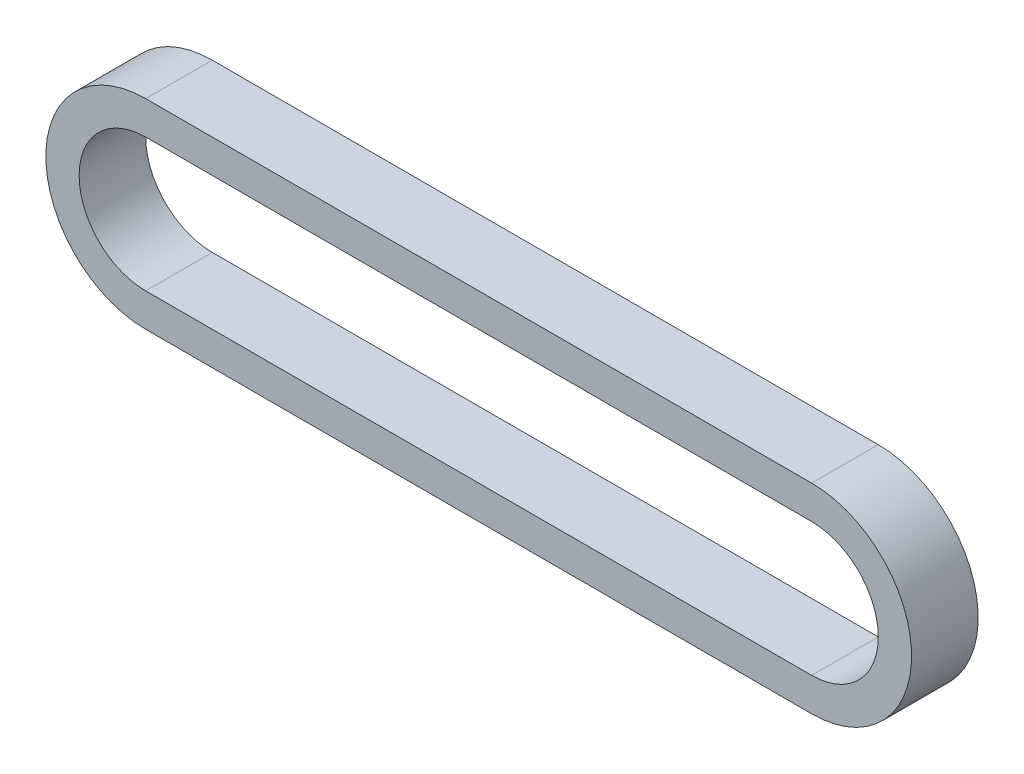
ISO-10303-21;
HEADER;
FILE_DESCRIPTION(('STEP AP214'),'2;1');
FILE_NAME('part.step','',(''),(''),'','','');
FILE_SCHEMA(('AUTOMOTIVE_DESIGN { 1 0 10303 214 1 1 1 1 }'));
ENDSEC;
DATA;
#1=APPLICATION_CONTEXT('core data for automotive mechanical design processes');
#2=APPLICATION_PROTOCOL_DEFINITION('international standard','automotive_design',2000,#1);
#3=PRODUCT_CONTEXT('',#1,'mechanical');
#4=PRODUCT('Part','Part','',(#3));
#5=PRODUCT_RELATED_PRODUCT_CATEGORY('part','',(#4));
#6=PRODUCT_DEFINITION_FORMATION('','',#4);
#7=PRODUCT_DEFINITION_CONTEXT('part definition',#1,'design');
#8=PRODUCT_DEFINITION('design','',#6,#7);
#9=PRODUCT_DEFINITION_SHAPE('','',#8);
#10=(LENGTH_UNIT() NAMED_UNIT(*) SI_UNIT(.MILLI.,.METRE.));
#11=(NAMED_UNIT(*) PLANE_ANGLE_UNIT() SI_UNIT($,.RADIAN.));
#12=(NAMED_UNIT(*) SI_UNIT($,.STERADIAN.) SOLID_ANGLE_UNIT());
#13=UNCERTAINTY_MEASURE_WITH_UNIT(LENGTH_MEASURE(1.E-05),#10,'distance_accuracy_value','');
#14=(GEOMETRIC_REPRESENTATION_CONTEXT(3) GLOBAL_UNCERTAINTY_ASSIGNED_CONTEXT((#13)) GLOBAL_UNIT_ASSIGNED_CONTEXT((#10,
#11,#12)) REPRESENTATION_CONTEXT('',''));
#15=CARTESIAN_POINT('',(0.,0.,0.));
#16=DIRECTION('',(0.,0.,1.));
#17=DIRECTION('',(1.,0.,0.));
#18=AXIS2_PLACEMENT_3D('',#15,#16,#17);
#19=CARTESIAN_POINT('',(-5.02739309480247,3.85129518148195,0.5));
#20=DIRECTION('',(0.,0.,1.));
#21=DIRECTION('',(1.,0.,0.));
#22=AXIS2_PLACEMENT_3D('',#19,#20,#21);
#23=PLANE('',#22);
#24=CARTESIAN_POINT('',(-5.02739309480247,3.85129518148195,0.5));
#25=DIRECTION('',(0.,0.,1.));
#26=DIRECTION('',(1.,0.,0.));
#27=AXIS2_PLACEMENT_3D('',#24,#25,#26);
#28=CIRCLE('',#27,1.5);
#29=CARTESIAN_POINT('',(-5.02739309480247,5.35129518148195,0.5));
#30=VERTEX_POINT('',#29);
#31=CARTESIAN_POINT('',(-5.02739309480247,2.35129518148195,0.5));
#32=VERTEX_POINT('',#31);
#33=EDGE_CURVE('E140',#30,#32,#28,.T.);
#34=ORIENTED_EDGE('',*,*,#33,.T.);
#35=DIRECTION('',(1.,0.,0.));
#36=VECTOR('',#35,1.);
#37=CARTESIAN_POINT('',(-5.02739309480247,2.35129518148195,0.5));
#38=LINE('',#37,#36);
#39=CARTESIAN_POINT('',(4.97260690519753,2.35129518148195,0.5));
#40=VERTEX_POINT('',#39);
#41=EDGE_CURVE('E143',#32,#40,#38,.T.);
#42=ORIENTED_EDGE('',*,*,#41,.T.);
#43=CARTESIAN_POINT('',(4.97260690519753,3.85129518148195,0.5));
#44=DIRECTION('',(0.,0.,1.));
#45=DIRECTION('',(1.,0.,0.));
#46=AXIS2_PLACEMENT_3D('',#43,#44,#45);
#47=CIRCLE('',#46,1.5);
#48=CARTESIAN_POINT('',(4.97260690519753,5.35129518148195,0.5));
#49=VERTEX_POINT('',#48);
#50=EDGE_CURVE('E146',#40,#49,#47,.T.);
#51=ORIENTED_EDGE('',*,*,#50,.T.);
#52=DIRECTION('',(-1.,0.,0.));
#53=VECTOR('',#52,1.);
#54=CARTESIAN_POINT('',(-5.02739309480247,5.35129518148195,0.5));
#55=LINE('',#54,#53);
#56=EDGE_CURVE('E148',#49,#30,#55,.T.);
#57=ORIENTED_EDGE('',*,*,#56,.T.);
#58=EDGE_LOOP('',(#34,#42,#51,#57));
#59=FACE_BOUND('',#58,.T.);
#60=DIRECTION('',(1.,0.,0.));
#61=VECTOR('',#60,1.);
#62=CARTESIAN_POINT('',(-5.02739309480247,2.85129518148195,0.5));
#63=LINE('',#62,#61);
#64=CARTESIAN_POINT('',(-5.02739309480247,2.85129518148195,0.5));
#65=VERTEX_POINT('',#64);
#66=CARTESIAN_POINT('',(4.97260690519753,2.85129518148195,0.5));
#67=VERTEX_POINT('',#66);
#68=EDGE_CURVE('E112',#65,#67,#63,.T.);
#69=ORIENTED_EDGE('',*,*,#68,.F.);
#70=CARTESIAN_POINT('',(-5.02739309480247,3.85129518148195,0.5));
#71=DIRECTION('',(0.,0.,1.));
#72=DIRECTION('',(1.,0.,0.));
#73=AXIS2_PLACEMENT_3D('',#70,#71,#72);
#74=CIRCLE('',#73,1.);
#75=CARTESIAN_POINT('',(-5.02739309480247,4.85129518148195,0.5));
#76=VERTEX_POINT('',#75);
#77=EDGE_CURVE('E104',#76,#65,#74,.T.);
#78=ORIENTED_EDGE('',*,*,#77,.F.);
#79=DIRECTION('',(-1.,0.,0.));
#80=VECTOR('',#79,1.);
#81=CARTESIAN_POINT('',(-5.02739309480247,4.85129518148195,0.5));
#82=LINE('',#81,#80);
#83=CARTESIAN_POINT('',(4.97260690519753,4.85129518148195,0.5));
#84=VERTEX_POINT('',#83);
#85=EDGE_CURVE('E126',#84,#76,#82,.T.);
#86=ORIENTED_EDGE('',*,*,#85,.F.);
#87=CARTESIAN_POINT('',(4.97260690519753,3.85129518148195,0.5));
#88=DIRECTION('',(0.,0.,1.));
#89=DIRECTION('',(1.,0.,0.));
#90=AXIS2_PLACEMENT_3D('',#87,#88,#89);
#91=CIRCLE('',#90,1.);
#92=EDGE_CURVE('E124',#67,#84,#91,.T.);
#93=ORIENTED_EDGE('',*,*,#92,.F.);
#94=EDGE_LOOP('',(#69,#78,#86,#93));
#95=FACE_BOUND('',#94,.T.);
#96=ADVANCED_FACE('F39',(#59,#95),#23,.T.);
#97=CARTESIAN_POINT('',(-5.02739309480247,3.85129518148195,-0.5));
#98=DIRECTION('',(0.,0.,1.));
#99=DIRECTION('',(1.,0.,0.));
#100=AXIS2_PLACEMENT_3D('',#97,#98,#99);
#101=PLANE('',#100);
#102=CARTESIAN_POINT('',(-5.02739309480247,3.85129518148195,-0.5));
#103=DIRECTION('',(0.,0.,1.));
#104=DIRECTION('',(1.,0.,0.));
#105=AXIS2_PLACEMENT_3D('',#102,#103,#104);
#106=CIRCLE('',#105,1.5);
#107=CARTESIAN_POINT('',(-5.02739309480247,5.35129518148195,-0.5));
#108=VERTEX_POINT('',#107);
#109=CARTESIAN_POINT('',(-5.02739309480247,2.35129518148195,-0.5));
#110=VERTEX_POINT('',#109);
#111=EDGE_CURVE('E120',#108,#110,#106,.T.);
#112=ORIENTED_EDGE('',*,*,#111,.F.);
#113=DIRECTION('',(-1.,0.,0.));
#114=VECTOR('',#113,1.);
#115=CARTESIAN_POINT('',(-5.02739309480247,5.35129518148195,-0.5));
#116=LINE('',#115,#114);
#117=CARTESIAN_POINT('',(4.97260690519753,5.35129518148195,-0.5));
#118=VERTEX_POINT('',#117);
#119=EDGE_CURVE('E144',#118,#108,#116,.T.);
#120=ORIENTED_EDGE('',*,*,#119,.F.);
#121=CARTESIAN_POINT('',(4.97260690519753,3.85129518148195,-0.5));
#122=DIRECTION('',(0.,0.,1.));
#123=DIRECTION('',(1.,0.,0.));
#124=AXIS2_PLACEMENT_3D('',#121,#122,#123);
#125=CIRCLE('',#124,1.5);
#126=CARTESIAN_POINT('',(4.97260690519753,2.35129518148195,-0.5));
#127=VERTEX_POINT('',#126);
#128=EDGE_CURVE('E155',#127,#118,#125,.T.);
#129=ORIENTED_EDGE('',*,*,#128,.F.);
#130=DIRECTION('',(1.,0.,0.));
#131=VECTOR('',#130,1.);
#132=CARTESIAN_POINT('',(-5.02739309480247,2.35129518148195,-0.5));
#133=LINE('',#132,#131);
#134=EDGE_CURVE('E153',#110,#127,#133,.T.);
#135=ORIENTED_EDGE('',*,*,#134,.F.);
#136=EDGE_LOOP('',(#112,#120,#129,#135));
#137=FACE_BOUND('',#136,.T.);
#138=CARTESIAN_POINT('',(-5.02739309480247,3.85129518148195,-0.5));
#139=DIRECTION('',(0.,0.,1.));
#140=DIRECTION('',(1.,0.,0.));
#141=AXIS2_PLACEMENT_3D('',#138,#139,#140);
#142=CIRCLE('',#141,1.);
#143=CARTESIAN_POINT('',(-5.02739309480247,4.85129518148195,-0.5));
#144=VERTEX_POINT('',#143);
#145=CARTESIAN_POINT('',(-5.02739309480247,2.85129518148195,-0.5));
#146=VERTEX_POINT('',#145);
#147=EDGE_CURVE('E62',#144,#146,#142,.T.);
#148=ORIENTED_EDGE('',*,*,#147,.T.);
#149=DIRECTION('',(1.,0.,0.));
#150=VECTOR('',#149,1.);
#151=CARTESIAN_POINT('',(-5.02739309480247,2.85129518148195,-0.5));
#152=LINE('',#151,#150);
#153=CARTESIAN_POINT('',(4.97260690519753,2.85129518148195,-0.5));
#154=VERTEX_POINT('',#153);
#155=EDGE_CURVE('E119',#146,#154,#152,.T.);
#156=ORIENTED_EDGE('',*,*,#155,.T.);
#157=CARTESIAN_POINT('',(4.97260690519753,3.85129518148195,-0.5));
#158=DIRECTION('',(0.,0.,1.));
#159=DIRECTION('',(1.,0.,0.));
#160=AXIS2_PLACEMENT_3D('',#157,#158,#159);
#161=CIRCLE('',#160,1.);
#162=CARTESIAN_POINT('',(4.97260690519753,4.85129518148195,-0.5));
#163=VERTEX_POINT('',#162);
#164=EDGE_CURVE('E132',#154,#163,#161,.T.);
#165=ORIENTED_EDGE('',*,*,#164,.T.);
#166=DIRECTION('',(-1.,0.,0.));
#167=VECTOR('',#166,1.);
#168=CARTESIAN_POINT('',(-5.02739309480247,4.85129518148195,-0.5));
#169=LINE('',#168,#167);
#170=EDGE_CURVE('E113',#163,#144,#169,.T.);
#171=ORIENTED_EDGE('',*,*,#170,.T.);
#172=EDGE_LOOP('',(#148,#156,#165,#171));
#173=FACE_BOUND('',#172,.T.);
#174=ADVANCED_FACE('F173',(#137,#173),#101,.F.);
#175=CARTESIAN_POINT('',(-5.02739309480247,3.85129518148195,0.5));
#176=DIRECTION('',(0.,0.,-1.));
#177=DIRECTION('',(-1.,0.,0.));
#178=AXIS2_PLACEMENT_3D('',#175,#176,#177);
#179=CYLINDRICAL_SURFACE('',#178,1.5);
#180=ORIENTED_EDGE('',*,*,#111,.T.);
#181=DIRECTION('',(0.,0.,-1.));
#182=VECTOR('',#181,1.);
#183=CARTESIAN_POINT('',(-5.02739309480247,2.35129518148195,0.5));
#184=LINE('',#183,#182);
#185=EDGE_CURVE('E11',#32,#110,#184,.T.);
#186=ORIENTED_EDGE('',*,*,#185,.F.);
#187=ORIENTED_EDGE('',*,*,#33,.F.);
#188=DIRECTION('',(0.,0.,-1.));
#189=VECTOR('',#188,1.);
#190=CARTESIAN_POINT('',(-5.02739309480247,5.35129518148195,0.5));
#191=LINE('',#190,#189);
#192=EDGE_CURVE('E150',#30,#108,#191,.T.);
#193=ORIENTED_EDGE('',*,*,#192,.T.);
#194=EDGE_LOOP('',(#180,#186,#187,#193));
#195=FACE_BOUND('',#194,.T.);
#196=ADVANCED_FACE('F41',(#195),#179,.T.);
#197=CARTESIAN_POINT('',(-5.02739309480247,2.35129518148195,0.5));
#198=DIRECTION('',(0.,1.,0.));
#199=DIRECTION('',(0.,0.,1.));
#200=AXIS2_PLACEMENT_3D('',#197,#198,#199);
#201=PLANE('',#200);
#202=ORIENTED_EDGE('',*,*,#134,.T.);
#203=DIRECTION('',(0.,0.,-1.));
#204=VECTOR('',#203,1.);
#205=CARTESIAN_POINT('',(4.97260690519753,2.35129518148195,0.5));
#206=LINE('',#205,#204);
#207=EDGE_CURVE('E47',#40,#127,#206,.T.);
#208=ORIENTED_EDGE('',*,*,#207,.F.);
#209=ORIENTED_EDGE('',*,*,#41,.F.);
#210=ORIENTED_EDGE('',*,*,#185,.T.);
#211=EDGE_LOOP('',(#202,#208,#209,#210));
#212=FACE_BOUND('',#211,.T.);
#213=ADVANCED_FACE('F183',(#212),#201,.F.);
#214=CARTESIAN_POINT('',(4.97260690519753,3.85129518148195,0.5));
#215=DIRECTION('',(0.,0.,-1.));
#216=DIRECTION('',(-1.,0.,0.));
#217=AXIS2_PLACEMENT_3D('',#214,#215,#216);
#218=CYLINDRICAL_SURFACE('',#217,1.5);
#219=ORIENTED_EDGE('',*,*,#128,.T.);
#220=DIRECTION('',(0.,0.,-1.));
#221=VECTOR('',#220,1.);
#222=CARTESIAN_POINT('',(4.97260690519753,5.35129518148195,0.5));
#223=LINE('',#222,#221);
#224=EDGE_CURVE('E160',#49,#118,#223,.T.);
#225=ORIENTED_EDGE('',*,*,#224,.F.);
#226=ORIENTED_EDGE('',*,*,#50,.F.);
#227=ORIENTED_EDGE('',*,*,#207,.T.);
#228=EDGE_LOOP('',(#219,#225,#226,#227));
#229=FACE_BOUND('',#228,.T.);
#230=ADVANCED_FACE('F167',(#229),#218,.T.);
#231=CARTESIAN_POINT('',(-5.02739309480247,5.35129518148195,0.5));
#232=DIRECTION('',(0.,-1.,0.));
#233=DIRECTION('',(0.,0.,-1.));
#234=AXIS2_PLACEMENT_3D('',#231,#232,#233);
#235=PLANE('',#234);
#236=ORIENTED_EDGE('',*,*,#119,.T.);
#237=ORIENTED_EDGE('',*,*,#192,.F.);
#238=ORIENTED_EDGE('',*,*,#56,.F.);
#239=ORIENTED_EDGE('',*,*,#224,.T.);
#240=EDGE_LOOP('',(#236,#237,#238,#239));
#241=FACE_BOUND('',#240,.T.);
#242=ADVANCED_FACE('F177',(#241),#235,.F.);
#243=CARTESIAN_POINT('',(-5.02739309480247,3.85129518148195,0.5));
#244=DIRECTION('',(0.,0.,-1.));
#245=DIRECTION('',(-1.,0.,0.));
#246=AXIS2_PLACEMENT_3D('',#243,#244,#245);
#247=CYLINDRICAL_SURFACE('',#246,1.);
#248=ORIENTED_EDGE('',*,*,#147,.F.);
#249=DIRECTION('',(0.,0.,-1.));
#250=VECTOR('',#249,1.);
#251=CARTESIAN_POINT('',(-5.02739309480247,4.85129518148195,0.5));
#252=LINE('',#251,#250);
#253=EDGE_CURVE('E108',#76,#144,#252,.T.);
#254=ORIENTED_EDGE('',*,*,#253,.F.);
#255=ORIENTED_EDGE('',*,*,#77,.T.);
#256=DIRECTION('',(0.,0.,-1.));
#257=VECTOR('',#256,1.);
#258=CARTESIAN_POINT('',(-5.02739309480247,2.85129518148195,0.5));
#259=LINE('',#258,#257);
#260=EDGE_CURVE('E107',#65,#146,#259,.T.);
#261=ORIENTED_EDGE('',*,*,#260,.T.);
#262=EDGE_LOOP('',(#248,#254,#255,#261));
#263=FACE_BOUND('',#262,.T.);
#264=ADVANCED_FACE('F106',(#263),#247,.F.);
#265=CARTESIAN_POINT('',(-5.02739309480247,2.85129518148195,0.5));
#266=DIRECTION('',(0.,1.,0.));
#267=DIRECTION('',(0.,0.,1.));
#268=AXIS2_PLACEMENT_3D('',#265,#266,#267);
#269=PLANE('',#268);
#270=ORIENTED_EDGE('',*,*,#155,.F.);
#271=ORIENTED_EDGE('',*,*,#260,.F.);
#272=ORIENTED_EDGE('',*,*,#68,.T.);
#273=DIRECTION('',(0.,0.,-1.));
#274=VECTOR('',#273,1.);
#275=CARTESIAN_POINT('',(4.97260690519753,2.85129518148195,0.5));
#276=LINE('',#275,#274);
#277=EDGE_CURVE('E121',#67,#154,#276,.T.);
#278=ORIENTED_EDGE('',*,*,#277,.T.);
#279=EDGE_LOOP('',(#270,#271,#272,#278));
#280=FACE_BOUND('',#279,.T.);
#281=ADVANCED_FACE('F116',(#280),#269,.T.);
#282=CARTESIAN_POINT('',(4.97260690519753,3.85129518148195,0.5));
#283=DIRECTION('',(0.,0.,-1.));
#284=DIRECTION('',(-1.,0.,0.));
#285=AXIS2_PLACEMENT_3D('',#282,#283,#284);
#286=CYLINDRICAL_SURFACE('',#285,1.);
#287=ORIENTED_EDGE('',*,*,#164,.F.);
#288=ORIENTED_EDGE('',*,*,#277,.F.);
#289=ORIENTED_EDGE('',*,*,#92,.T.);
#290=DIRECTION('',(0.,0.,-1.));
#291=VECTOR('',#290,1.);
#292=CARTESIAN_POINT('',(4.97260690519753,4.85129518148195,0.5));
#293=LINE('',#292,#291);
#294=EDGE_CURVE('E54',#84,#163,#293,.T.);
#295=ORIENTED_EDGE('',*,*,#294,.T.);
#296=EDGE_LOOP('',(#287,#288,#289,#295));
#297=FACE_BOUND('',#296,.T.);
#298=ADVANCED_FACE('F206',(#297),#286,.F.);
#299=CARTESIAN_POINT('',(-5.02739309480247,4.85129518148195,0.5));
#300=DIRECTION('',(0.,-1.,0.));
#301=DIRECTION('',(0.,0.,-1.));
#302=AXIS2_PLACEMENT_3D('',#299,#300,#301);
#303=PLANE('',#302);
#304=ORIENTED_EDGE('',*,*,#170,.F.);
#305=ORIENTED_EDGE('',*,*,#294,.F.);
#306=ORIENTED_EDGE('',*,*,#85,.T.);
#307=ORIENTED_EDGE('',*,*,#253,.T.);
#308=EDGE_LOOP('',(#304,#305,#306,#307));
#309=FACE_BOUND('',#308,.T.);
#310=ADVANCED_FACE('F210',(#309),#303,.T.);
#311=CLOSED_SHELL('',(#96,#174,#196,#213,#230,#242,#264,#281,#298,#310));
#312=MANIFOLD_SOLID_BREP('B2',#311);
#313=ADVANCED_BREP_SHAPE_REPRESENTATION('',(#18,#312),#14);
#314=SHAPE_DEFINITION_REPRESENTATION(#9,#313);
ENDSEC;
END-ISO-10303-21;
